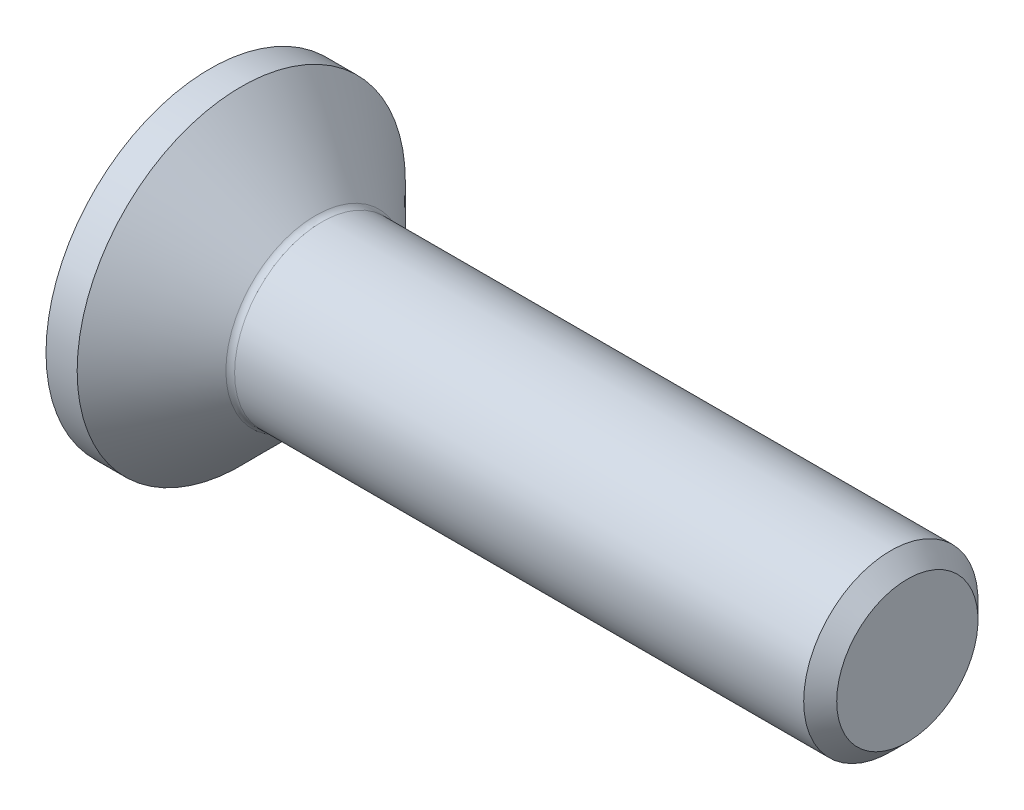
ISO-10303-21;
HEADER;
FILE_DESCRIPTION(('STEP AP214'),'2;1');
FILE_NAME('part.step','',(''),(''),'','','');
FILE_SCHEMA(('AUTOMOTIVE_DESIGN { 1 0 10303 214 1 1 1 1 }'));
ENDSEC;
DATA;
#1=APPLICATION_CONTEXT('core data for automotive mechanical design processes');
#2=APPLICATION_PROTOCOL_DEFINITION('international standard','automotive_design',2000,#1);
#3=PRODUCT_CONTEXT('',#1,'mechanical');
#4=PRODUCT('Part','Part','',(#3));
#5=PRODUCT_RELATED_PRODUCT_CATEGORY('part','',(#4));
#6=PRODUCT_DEFINITION_FORMATION('','',#4);
#7=PRODUCT_DEFINITION_CONTEXT('part definition',#1,'design');
#8=PRODUCT_DEFINITION('design','',#6,#7);
#9=PRODUCT_DEFINITION_SHAPE('','',#8);
#10=(LENGTH_UNIT() NAMED_UNIT(*) SI_UNIT(.MILLI.,.METRE.));
#11=(NAMED_UNIT(*) PLANE_ANGLE_UNIT() SI_UNIT($,.RADIAN.));
#12=(NAMED_UNIT(*) SI_UNIT($,.STERADIAN.) SOLID_ANGLE_UNIT());
#13=UNCERTAINTY_MEASURE_WITH_UNIT(LENGTH_MEASURE(1.E-05),#10,'distance_accuracy_value','');
#14=(GEOMETRIC_REPRESENTATION_CONTEXT(3) GLOBAL_UNCERTAINTY_ASSIGNED_CONTEXT((#13)) GLOBAL_UNIT_ASSIGNED_CONTEXT((#10,
#11,#12)) REPRESENTATION_CONTEXT('',''));
#15=CARTESIAN_POINT('',(0.,0.,0.));
#16=DIRECTION('',(0.,0.,1.));
#17=DIRECTION('',(1.,0.,0.));
#18=AXIS2_PLACEMENT_3D('',#15,#16,#17);
#19=CARTESIAN_POINT('',(2.48,0.,0.));
#20=DIRECTION('',(-1.,0.,0.));
#21=DIRECTION('',(0.,0.,1.));
#22=AXIS2_PLACEMENT_3D('',#19,#20,#21);
#23=CONICAL_SURFACE('',#22,2.,0.785398163397448);
#24=CARTESIAN_POINT('',(0.714999999999996,0.,0.));
#25=DIRECTION('',(-1.,0.,0.));
#26=DIRECTION('',(0.,0.,1.));
#27=AXIS2_PLACEMENT_3D('',#24,#25,#26);
#28=CIRCLE('',#27,3.765);
#29=CARTESIAN_POINT('',(0.714999999999996,0.,3.765));
#30=VERTEX_POINT('',#29);
#31=EDGE_CURVE('E40',#30,#30,#28,.F.);
#32=ORIENTED_EDGE('',*,*,#31,.T.);
#33=EDGE_LOOP('',(#32));
#34=FACE_BOUND('',#33,.T.);
#35=CARTESIAN_POINT('',(2.42142135623731,0.,0.));
#36=DIRECTION('',(-1.,0.,0.));
#37=DIRECTION('',(0.,0.,1.));
#38=AXIS2_PLACEMENT_3D('',#35,#36,#37);
#39=CIRCLE('',#38,2.05857864376269);
#40=CARTESIAN_POINT('',(2.42142135623731,0.,2.05857864376269));
#41=VERTEX_POINT('',#40);
#42=EDGE_CURVE('E159',#41,#41,#39,.T.);
#43=ORIENTED_EDGE('',*,*,#42,.T.);
#44=EDGE_LOOP('',(#43));
#45=FACE_BOUND('',#44,.T.);
#46=ADVANCED_FACE('F36',(#34,#45),#23,.T.);
#47=CARTESIAN_POINT('',(-0.587069180985524,0.,0.));
#48=DIRECTION('',(-1.,0.,0.));
#49=DIRECTION('',(0.,0.,1.));
#50=AXIS2_PLACEMENT_3D('',#47,#48,#49);
#51=CYLINDRICAL_SURFACE('',#50,2.);
#52=CARTESIAN_POINT('',(15.621,0.,0.));
#53=DIRECTION('',(-1.,0.,0.));
#54=DIRECTION('',(0.,0.,1.));
#55=AXIS2_PLACEMENT_3D('',#52,#53,#54);
#56=CIRCLE('',#55,2.);
#57=CARTESIAN_POINT('',(15.621,0.,2.));
#58=VERTEX_POINT('',#57);
#59=EDGE_CURVE('E45',#58,#58,#56,.T.);
#60=ORIENTED_EDGE('',*,*,#59,.T.);
#61=EDGE_LOOP('',(#60));
#62=FACE_BOUND('',#61,.T.);
#63=CARTESIAN_POINT('',(2.56284271247462,0.,0.));
#64=DIRECTION('',(-1.,0.,0.));
#65=DIRECTION('',(0.,0.,1.));
#66=AXIS2_PLACEMENT_3D('',#63,#64,#65);
#67=CIRCLE('',#66,2.);
#68=CARTESIAN_POINT('',(2.56284271247462,0.,2.));
#69=VERTEX_POINT('',#68);
#70=EDGE_CURVE('E156',#69,#69,#67,.F.);
#71=ORIENTED_EDGE('',*,*,#70,.T.);
#72=EDGE_LOOP('',(#71));
#73=FACE_BOUND('',#72,.T.);
#74=ADVANCED_FACE('F127',(#62,#73),#51,.T.);
#75=CARTESIAN_POINT('',(16.,2.,0.));
#76=DIRECTION('',(-1.,0.,0.));
#77=DIRECTION('',(0.,0.,1.));
#78=AXIS2_PLACEMENT_3D('',#75,#76,#77);
#79=PLANE('',#78);
#80=CARTESIAN_POINT('',(16.,0.,0.));
#81=DIRECTION('',(-1.,0.,0.));
#82=DIRECTION('',(0.,0.,1.));
#83=AXIS2_PLACEMENT_3D('',#80,#81,#82);
#84=CIRCLE('',#83,1.621);
#85=CARTESIAN_POINT('',(16.,0.,1.621));
#86=VERTEX_POINT('',#85);
#87=EDGE_CURVE('E11',#86,#86,#84,.F.);
#88=ORIENTED_EDGE('',*,*,#87,.T.);
#89=EDGE_LOOP('',(#88));
#90=FACE_BOUND('',#89,.T.);
#91=ADVANCED_FACE('F133',(#90),#79,.F.);
#92=CARTESIAN_POINT('',(2.56284271247462,0.,0.));
#93=DIRECTION('',(-1.,0.,0.));
#94=DIRECTION('',(0.,0.,1.));
#95=AXIS2_PLACEMENT_3D('',#92,#93,#94);
#96=TOROIDAL_SURFACE('',#95,2.2,0.2);
#97=ORIENTED_EDGE('',*,*,#70,.F.);
#98=EDGE_LOOP('',(#97));
#99=FACE_BOUND('',#98,.T.);
#100=ORIENTED_EDGE('',*,*,#42,.F.);
#101=EDGE_LOOP('',(#100));
#102=FACE_BOUND('',#101,.T.);
#103=ADVANCED_FACE('F144',(#99,#102),#96,.F.);
#104=CARTESIAN_POINT('',(15.621,0.,0.));
#105=DIRECTION('',(-1.,0.,0.));
#106=DIRECTION('',(0.,0.,1.));
#107=AXIS2_PLACEMENT_3D('',#104,#105,#106);
#108=CONICAL_SURFACE('',#107,2.,0.785398163397444);
#109=ORIENTED_EDGE('',*,*,#87,.F.);
#110=EDGE_LOOP('',(#109));
#111=FACE_BOUND('',#110,.T.);
#112=ORIENTED_EDGE('',*,*,#59,.F.);
#113=EDGE_LOOP('',(#112));
#114=FACE_BOUND('',#113,.T.);
#115=ADVANCED_FACE('F38',(#111,#114),#108,.T.);
#116=CARTESIAN_POINT('',(11.8531386861314,0.,0.));
#117=DIRECTION('',(1.,0.,0.));
#118=DIRECTION('',(0.,0.,-1.));
#119=AXIS2_PLACEMENT_3D('',#116,#117,#118);
#120=CYLINDRICAL_SURFACE('',#119,3.765);
#121=ORIENTED_EDGE('',*,*,#31,.F.);
#122=EDGE_LOOP('',(#121));
#123=FACE_BOUND('',#122,.T.);
#124=CARTESIAN_POINT('',(0.,0.,0.));
#125=DIRECTION('',(1.,0.,0.));
#126=DIRECTION('',(0.,0.,-1.));
#127=AXIS2_PLACEMENT_3D('',#124,#125,#126);
#128=CIRCLE('',#127,3.765);
#129=CARTESIAN_POINT('',(0.,0.,-3.765));
#130=VERTEX_POINT('',#129);
#131=EDGE_CURVE('E225',#130,#130,#128,.F.);
#132=ORIENTED_EDGE('',*,*,#131,.F.);
#133=EDGE_LOOP('',(#132));
#134=FACE_BOUND('',#133,.T.);
#135=ADVANCED_FACE('F114',(#123,#134),#120,.T.);
#136=CARTESIAN_POINT('',(2.22168783648704,0.,0.));
#137=DIRECTION('',(-1.,0.,0.));
#138=DIRECTION('',(0.,0.,1.));
#139=AXIS2_PLACEMENT_3D('',#136,#137,#138);
#140=CONICAL_SURFACE('',#139,0.,1.0471975511966);
#141=CARTESIAN_POINT('',(1.5,0.,0.));
#142=DIRECTION('',(-1.,0.,0.));
#143=DIRECTION('',(0.,0.,1.));
#144=AXIS2_PLACEMENT_3D('',#141,#142,#143);
#145=CIRCLE('',#144,1.25);
#146=CARTESIAN_POINT('',(1.5,0.625,1.08253175473055));
#147=VERTEX_POINT('',#146);
#148=CARTESIAN_POINT('',(1.5,1.25,0.));
#149=VERTEX_POINT('',#148);
#150=EDGE_CURVE('E165',#147,#149,#145,.T.);
#151=ORIENTED_EDGE('',*,*,#150,.T.);
#152=CARTESIAN_POINT('',(1.5,0.625000000000001,-1.08253175473055));
#153=VERTEX_POINT('',#152);
#154=EDGE_CURVE('E160',#149,#153,#145,.T.);
#155=ORIENTED_EDGE('',*,*,#154,.T.);
#156=CARTESIAN_POINT('',(1.5,-0.625,-1.08253175473055));
#157=VERTEX_POINT('',#156);
#158=EDGE_CURVE('E163',#153,#157,#145,.T.);
#159=ORIENTED_EDGE('',*,*,#158,.T.);
#160=CARTESIAN_POINT('',(1.5,-1.25,0.));
#161=VERTEX_POINT('',#160);
#162=EDGE_CURVE('E244',#157,#161,#145,.T.);
#163=ORIENTED_EDGE('',*,*,#162,.T.);
#164=CARTESIAN_POINT('',(1.5,-0.625,1.08253175473055));
#165=VERTEX_POINT('',#164);
#166=EDGE_CURVE('E52',#161,#165,#145,.T.);
#167=ORIENTED_EDGE('',*,*,#166,.T.);
#168=EDGE_CURVE('E174',#165,#147,#145,.T.);
#169=ORIENTED_EDGE('',*,*,#168,.T.);
#170=EDGE_LOOP('',(#151,#155,#159,#163,#167,#169));
#171=FACE_BOUND('',#170,.T.);
#172=CARTESIAN_POINT('',(2.22168783648704,0.,0.));
#173=VERTEX_POINT('',#172);
#174=VERTEX_LOOP('',#173);
#175=FACE_BOUND('',#174,.T.);
#176=ADVANCED_FACE('F111',(#171,#175),#140,.F.);
#177=CARTESIAN_POINT('',(1.5,0.,-1.44337567297406));
#178=DIRECTION('',(1.,0.,0.));
#179=DIRECTION('',(0.,0.,-1.));
#180=AXIS2_PLACEMENT_3D('',#177,#178,#179);
#181=PLANE('',#180);
#182=ORIENTED_EDGE('',*,*,#166,.F.);
#183=DIRECTION('',(0.,0.,-1.));
#184=VECTOR('',#183,1.);
#185=CARTESIAN_POINT('',(1.5,-1.25,0.721687836487032));
#186=LINE('',#185,#184);
#187=CARTESIAN_POINT('',(1.5,-1.25,0.721687836487032));
#188=VERTEX_POINT('',#187);
#189=EDGE_CURVE('E185',#188,#161,#186,.T.);
#190=ORIENTED_EDGE('',*,*,#189,.F.);
#191=DIRECTION('',(0.,-0.866025403784438,-0.5));
#192=VECTOR('',#191,1.);
#193=CARTESIAN_POINT('',(1.5,0.,1.44337567297406));
#194=LINE('',#193,#192);
#195=EDGE_CURVE('E209',#165,#188,#194,.T.);
#196=ORIENTED_EDGE('',*,*,#195,.F.);
#197=EDGE_LOOP('',(#182,#190,#196));
#198=FACE_BOUND('',#197,.T.);
#199=ADVANCED_FACE('F113',(#198),#181,.F.);
#200=ORIENTED_EDGE('',*,*,#168,.F.);
#201=CARTESIAN_POINT('',(1.5,0.,1.44337567297406));
#202=VERTEX_POINT('',#201);
#203=EDGE_CURVE('E206',#202,#165,#194,.T.);
#204=ORIENTED_EDGE('',*,*,#203,.F.);
#205=DIRECTION('',(0.,-0.866025403784439,0.5));
#206=VECTOR('',#205,1.);
#207=CARTESIAN_POINT('',(1.5,1.25,0.721687836487032));
#208=LINE('',#207,#206);
#209=EDGE_CURVE('E213',#147,#202,#208,.T.);
#210=ORIENTED_EDGE('',*,*,#209,.F.);
#211=EDGE_LOOP('',(#200,#204,#210));
#212=FACE_BOUND('',#211,.T.);
#213=ADVANCED_FACE('F120',(#212),#181,.F.);
#214=ORIENTED_EDGE('',*,*,#150,.F.);
#215=CARTESIAN_POINT('',(1.5,1.25,0.721687836487032));
#216=VERTEX_POINT('',#215);
#217=EDGE_CURVE('E210',#216,#147,#208,.T.);
#218=ORIENTED_EDGE('',*,*,#217,.F.);
#219=DIRECTION('',(0.,0.,1.));
#220=VECTOR('',#219,1.);
#221=CARTESIAN_POINT('',(1.5,1.25,-0.721687836487031));
#222=LINE('',#221,#220);
#223=EDGE_CURVE('E217',#149,#216,#222,.T.);
#224=ORIENTED_EDGE('',*,*,#223,.F.);
#225=EDGE_LOOP('',(#214,#218,#224));
#226=FACE_BOUND('',#225,.T.);
#227=ADVANCED_FACE('F275',(#226),#181,.F.);
#228=ORIENTED_EDGE('',*,*,#154,.F.);
#229=CARTESIAN_POINT('',(1.5,1.25,-0.721687836487031));
#230=VERTEX_POINT('',#229);
#231=EDGE_CURVE('E214',#230,#149,#222,.T.);
#232=ORIENTED_EDGE('',*,*,#231,.F.);
#233=DIRECTION('',(0.,0.866025403784438,0.5));
#234=VECTOR('',#233,1.);
#235=CARTESIAN_POINT('',(1.5,0.,-1.44337567297406));
#236=LINE('',#235,#234);
#237=EDGE_CURVE('E221',#153,#230,#236,.T.);
#238=ORIENTED_EDGE('',*,*,#237,.F.);
#239=EDGE_LOOP('',(#228,#232,#238));
#240=FACE_BOUND('',#239,.T.);
#241=ADVANCED_FACE('F280',(#240),#181,.F.);
#242=ORIENTED_EDGE('',*,*,#158,.F.);
#243=CARTESIAN_POINT('',(1.5,0.,-1.44337567297406));
#244=VERTEX_POINT('',#243);
#245=EDGE_CURVE('E218',#244,#153,#236,.T.);
#246=ORIENTED_EDGE('',*,*,#245,.F.);
#247=DIRECTION('',(0.,0.866025403784439,-0.5));
#248=VECTOR('',#247,1.);
#249=CARTESIAN_POINT('',(1.5,-1.25,-0.721687836487033));
#250=LINE('',#249,#248);
#251=EDGE_CURVE('E189',#157,#244,#250,.T.);
#252=ORIENTED_EDGE('',*,*,#251,.F.);
#253=EDGE_LOOP('',(#242,#246,#252));
#254=FACE_BOUND('',#253,.T.);
#255=ADVANCED_FACE('F249',(#254),#181,.F.);
#256=ORIENTED_EDGE('',*,*,#162,.F.);
#257=CARTESIAN_POINT('',(1.5,-1.25,-0.721687836487033));
#258=VERTEX_POINT('',#257);
#259=EDGE_CURVE('E222',#258,#157,#250,.T.);
#260=ORIENTED_EDGE('',*,*,#259,.F.);
#261=EDGE_CURVE('E205',#161,#258,#186,.T.);
#262=ORIENTED_EDGE('',*,*,#261,.F.);
#263=EDGE_LOOP('',(#256,#260,#262));
#264=FACE_BOUND('',#263,.T.);
#265=ADVANCED_FACE('F123',(#264),#181,.F.);
#266=CARTESIAN_POINT('',(1.5,-1.25,0.721687836487032));
#267=DIRECTION('',(0.,1.,0.));
#268=DIRECTION('',(0.,0.,1.));
#269=AXIS2_PLACEMENT_3D('',#266,#267,#268);
#270=PLANE('',#269);
#271=DIRECTION('',(0.,0.,-1.));
#272=VECTOR('',#271,1.);
#273=CARTESIAN_POINT('',(0.,-1.25,0.721687836487032));
#274=LINE('',#273,#272);
#275=CARTESIAN_POINT('',(0.,-1.25,0.721687836487032));
#276=VERTEX_POINT('',#275);
#277=CARTESIAN_POINT('',(0.,-1.25,-0.721687836487033));
#278=VERTEX_POINT('',#277);
#279=EDGE_CURVE('E186',#276,#278,#274,.T.);
#280=ORIENTED_EDGE('',*,*,#279,.F.);
#281=DIRECTION('',(-1.,0.,0.));
#282=VECTOR('',#281,1.);
#283=CARTESIAN_POINT('',(1.5,-1.25,0.721687836487032));
#284=LINE('',#283,#282);
#285=EDGE_CURVE('E181',#188,#276,#284,.T.);
#286=ORIENTED_EDGE('',*,*,#285,.F.);
#287=ORIENTED_EDGE('',*,*,#189,.T.);
#288=ORIENTED_EDGE('',*,*,#261,.T.);
#289=DIRECTION('',(-1.,0.,0.));
#290=VECTOR('',#289,1.);
#291=CARTESIAN_POINT('',(1.5,-1.25,-0.721687836487033));
#292=LINE('',#291,#290);
#293=EDGE_CURVE('E183',#258,#278,#292,.T.);
#294=ORIENTED_EDGE('',*,*,#293,.T.);
#295=EDGE_LOOP('',(#280,#286,#287,#288,#294));
#296=FACE_BOUND('',#295,.T.);
#297=ADVANCED_FACE('F238',(#296),#270,.T.);
#298=CARTESIAN_POINT('',(1.5,0.,1.44337567297406));
#299=DIRECTION('',(0.,0.5,-0.866025403784438));
#300=DIRECTION('',(0.,0.866025403784438,0.5));
#301=AXIS2_PLACEMENT_3D('',#298,#299,#300);
#302=PLANE('',#301);
#303=DIRECTION('',(0.,-0.866025403784438,-0.5));
#304=VECTOR('',#303,1.);
#305=CARTESIAN_POINT('',(0.,0.,1.44337567297406));
#306=LINE('',#305,#304);
#307=CARTESIAN_POINT('',(0.,0.,1.44337567297406));
#308=VERTEX_POINT('',#307);
#309=EDGE_CURVE('E190',#308,#276,#306,.T.);
#310=ORIENTED_EDGE('',*,*,#309,.F.);
#311=DIRECTION('',(-1.,0.,0.));
#312=VECTOR('',#311,1.);
#313=CARTESIAN_POINT('',(1.5,0.,1.44337567297406));
#314=LINE('',#313,#312);
#315=EDGE_CURVE('E179',#202,#308,#314,.T.);
#316=ORIENTED_EDGE('',*,*,#315,.F.);
#317=ORIENTED_EDGE('',*,*,#203,.T.);
#318=ORIENTED_EDGE('',*,*,#195,.T.);
#319=ORIENTED_EDGE('',*,*,#285,.T.);
#320=EDGE_LOOP('',(#310,#316,#317,#318,#319));
#321=FACE_BOUND('',#320,.T.);
#322=ADVANCED_FACE('F268',(#321),#302,.T.);
#323=CARTESIAN_POINT('',(1.5,1.25,0.721687836487032));
#324=DIRECTION('',(0.,-0.5,-0.866025403784438));
#325=DIRECTION('',(0.,0.866025403784439,-0.5));
#326=AXIS2_PLACEMENT_3D('',#323,#324,#325);
#327=PLANE('',#326);
#328=DIRECTION('',(0.,-0.866025403784439,0.5));
#329=VECTOR('',#328,1.);
#330=CARTESIAN_POINT('',(0.,1.25,0.721687836487032));
#331=LINE('',#330,#329);
#332=CARTESIAN_POINT('',(0.,1.25,0.721687836487032));
#333=VERTEX_POINT('',#332);
#334=EDGE_CURVE('E193',#333,#308,#331,.T.);
#335=ORIENTED_EDGE('',*,*,#334,.F.);
#336=DIRECTION('',(-1.,0.,0.));
#337=VECTOR('',#336,1.);
#338=CARTESIAN_POINT('',(1.5,1.25,0.721687836487032));
#339=LINE('',#338,#337);
#340=EDGE_CURVE('E177',#216,#333,#339,.T.);
#341=ORIENTED_EDGE('',*,*,#340,.F.);
#342=ORIENTED_EDGE('',*,*,#217,.T.);
#343=ORIENTED_EDGE('',*,*,#209,.T.);
#344=ORIENTED_EDGE('',*,*,#315,.T.);
#345=EDGE_LOOP('',(#335,#341,#342,#343,#344));
#346=FACE_BOUND('',#345,.T.);
#347=ADVANCED_FACE('F262',(#346),#327,.T.);
#348=CARTESIAN_POINT('',(1.5,1.25,-0.721687836487031));
#349=DIRECTION('',(0.,-1.,0.));
#350=DIRECTION('',(0.,0.,-1.));
#351=AXIS2_PLACEMENT_3D('',#348,#349,#350);
#352=PLANE('',#351);
#353=DIRECTION('',(0.,0.,1.));
#354=VECTOR('',#353,1.);
#355=CARTESIAN_POINT('',(0.,1.25,-0.721687836487031));
#356=LINE('',#355,#354);
#357=CARTESIAN_POINT('',(0.,1.25,-0.721687836487031));
#358=VERTEX_POINT('',#357);
#359=EDGE_CURVE('E196',#358,#333,#356,.T.);
#360=ORIENTED_EDGE('',*,*,#359,.F.);
#361=DIRECTION('',(-1.,0.,0.));
#362=VECTOR('',#361,1.);
#363=CARTESIAN_POINT('',(1.5,1.25,-0.721687836487031));
#364=LINE('',#363,#362);
#365=EDGE_CURVE('E175',#230,#358,#364,.T.);
#366=ORIENTED_EDGE('',*,*,#365,.F.);
#367=ORIENTED_EDGE('',*,*,#231,.T.);
#368=ORIENTED_EDGE('',*,*,#223,.T.);
#369=ORIENTED_EDGE('',*,*,#340,.T.);
#370=EDGE_LOOP('',(#360,#366,#367,#368,#369));
#371=FACE_BOUND('',#370,.T.);
#372=ADVANCED_FACE('F258',(#371),#352,.T.);
#373=CARTESIAN_POINT('',(1.5,0.,-1.44337567297406));
#374=DIRECTION('',(0.,-0.5,0.866025403784438));
#375=DIRECTION('',(0.,-0.866025403784438,-0.5));
#376=AXIS2_PLACEMENT_3D('',#373,#374,#375);
#377=PLANE('',#376);
#378=DIRECTION('',(0.,0.866025403784438,0.5));
#379=VECTOR('',#378,1.);
#380=CARTESIAN_POINT('',(0.,0.,-1.44337567297406));
#381=LINE('',#380,#379);
#382=CARTESIAN_POINT('',(0.,0.,-1.44337567297406));
#383=VERTEX_POINT('',#382);
#384=EDGE_CURVE('E199',#383,#358,#381,.T.);
#385=ORIENTED_EDGE('',*,*,#384,.F.);
#386=DIRECTION('',(-1.,0.,0.));
#387=VECTOR('',#386,1.);
#388=CARTESIAN_POINT('',(1.5,0.,-1.44337567297406));
#389=LINE('',#388,#387);
#390=EDGE_CURVE('E167',#244,#383,#389,.T.);
#391=ORIENTED_EDGE('',*,*,#390,.F.);
#392=ORIENTED_EDGE('',*,*,#245,.T.);
#393=ORIENTED_EDGE('',*,*,#237,.T.);
#394=ORIENTED_EDGE('',*,*,#365,.T.);
#395=EDGE_LOOP('',(#385,#391,#392,#393,#394));
#396=FACE_BOUND('',#395,.T.);
#397=ADVANCED_FACE('F253',(#396),#377,.T.);
#398=CARTESIAN_POINT('',(1.5,-1.25,-0.721687836487033));
#399=DIRECTION('',(0.,0.5,0.866025403784438));
#400=DIRECTION('',(0.,-0.866025403784439,0.5));
#401=AXIS2_PLACEMENT_3D('',#398,#399,#400);
#402=PLANE('',#401);
#403=DIRECTION('',(0.,0.866025403784439,-0.5));
#404=VECTOR('',#403,1.);
#405=CARTESIAN_POINT('',(0.,-1.25,-0.721687836487033));
#406=LINE('',#405,#404);
#407=EDGE_CURVE('E60',#278,#383,#406,.T.);
#408=ORIENTED_EDGE('',*,*,#407,.F.);
#409=ORIENTED_EDGE('',*,*,#293,.F.);
#410=ORIENTED_EDGE('',*,*,#259,.T.);
#411=ORIENTED_EDGE('',*,*,#251,.T.);
#412=ORIENTED_EDGE('',*,*,#390,.T.);
#413=EDGE_LOOP('',(#408,#409,#410,#411,#412));
#414=FACE_BOUND('',#413,.T.);
#415=ADVANCED_FACE('F142',(#414),#402,.T.);
#416=CARTESIAN_POINT('',(0.,0.,0.));
#417=DIRECTION('',(1.,0.,0.));
#418=DIRECTION('',(0.,0.,-1.));
#419=AXIS2_PLACEMENT_3D('',#416,#417,#418);
#420=PLANE('',#419);
#421=ORIENTED_EDGE('',*,*,#131,.T.);
#422=EDGE_LOOP('',(#421));
#423=FACE_BOUND('',#422,.T.);
#424=ORIENTED_EDGE('',*,*,#407,.T.);
#425=ORIENTED_EDGE('',*,*,#384,.T.);
#426=ORIENTED_EDGE('',*,*,#359,.T.);
#427=ORIENTED_EDGE('',*,*,#334,.T.);
#428=ORIENTED_EDGE('',*,*,#309,.T.);
#429=ORIENTED_EDGE('',*,*,#279,.T.);
#430=EDGE_LOOP('',(#424,#425,#426,#427,#428,#429));
#431=FACE_BOUND('',#430,.T.);
#432=ADVANCED_FACE('F140',(#423,#431),#420,.F.);
#433=CLOSED_SHELL('',(#46,#74,#91,#103,#115,#135,#176,#199,#213,#227,#241,#255,#265,#297,#322,
#347,#372,#397,#415,#432));
#434=MANIFOLD_SOLID_BREP('B2',#433);
#435=ADVANCED_BREP_SHAPE_REPRESENTATION('',(#18,#434),#14);
#436=SHAPE_DEFINITION_REPRESENTATION(#9,#435);
ENDSEC;
END-ISO-10303-21;
